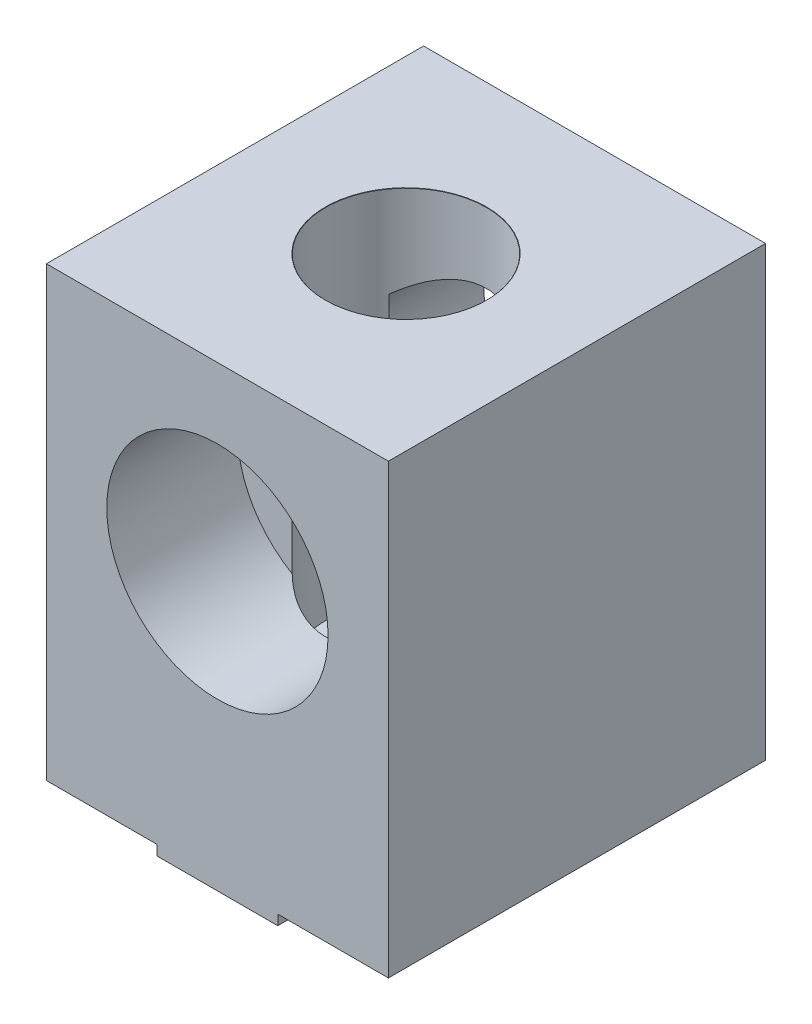
ISO-10303-21;
HEADER;
FILE_DESCRIPTION(('STEP AP214'),'2;1');
FILE_NAME('part.step','',(''),(''),'','','');
FILE_SCHEMA(('AUTOMOTIVE_DESIGN { 1 0 10303 214 1 1 1 1 }'));
ENDSEC;
DATA;
#1=APPLICATION_CONTEXT('core data for automotive mechanical design processes');
#2=APPLICATION_PROTOCOL_DEFINITION('international standard','automotive_design',2000,#1);
#3=PRODUCT_CONTEXT('',#1,'mechanical');
#4=PRODUCT('Part','Part','',(#3));
#5=PRODUCT_RELATED_PRODUCT_CATEGORY('part','',(#4));
#6=PRODUCT_DEFINITION_FORMATION('','',#4);
#7=PRODUCT_DEFINITION_CONTEXT('part definition',#1,'design');
#8=PRODUCT_DEFINITION('design','',#6,#7);
#9=PRODUCT_DEFINITION_SHAPE('','',#8);
#10=(LENGTH_UNIT() NAMED_UNIT(*) SI_UNIT(.MILLI.,.METRE.));
#11=(NAMED_UNIT(*) PLANE_ANGLE_UNIT() SI_UNIT($,.RADIAN.));
#12=(NAMED_UNIT(*) SI_UNIT($,.STERADIAN.) SOLID_ANGLE_UNIT());
#13=UNCERTAINTY_MEASURE_WITH_UNIT(LENGTH_MEASURE(1.E-05),#10,'distance_accuracy_value','');
#14=(GEOMETRIC_REPRESENTATION_CONTEXT(3) GLOBAL_UNCERTAINTY_ASSIGNED_CONTEXT((#13)) GLOBAL_UNIT_ASSIGNED_CONTEXT((#10,
#11,#12)) REPRESENTATION_CONTEXT('',''));
#15=CARTESIAN_POINT('',(0.,0.,0.));
#16=DIRECTION('',(0.,0.,1.));
#17=DIRECTION('',(1.,0.,0.));
#18=AXIS2_PLACEMENT_3D('',#15,#16,#17);
#19=CARTESIAN_POINT('',(0.,26.5,5.75));
#20=DIRECTION('',(0.,0.,1.));
#21=DIRECTION('',(1.,0.,0.));
#22=AXIS2_PLACEMENT_3D('',#19,#20,#21);
#23=PLANE('',#22);
#24=DIRECTION('',(0.,1.,0.));
#25=VECTOR('',#24,1.);
#26=CARTESIAN_POINT('',(5.56214886532174,44.5,5.75));
#27=LINE('',#26,#25);
#28=CARTESIAN_POINT('',(5.56214886532174,17.0098735519488,5.75));
#29=VERTEX_POINT('',#28);
#30=CARTESIAN_POINT('',(5.56214886532174,23.1365939882316,5.75000000000001));
#31=VERTEX_POINT('',#30);
#32=EDGE_CURVE('E277',#29,#31,#27,.T.);
#33=ORIENTED_EDGE('',*,*,#32,.F.);
#34=CARTESIAN_POINT('',(0.,26.5,5.75));
#35=DIRECTION('',(0.,0.,1.));
#36=DIRECTION('',(1.,0.,0.));
#37=AXIS2_PLACEMENT_3D('',#34,#35,#36);
#38=CIRCLE('',#37,11.);
#39=CARTESIAN_POINT('',(5.56214886532174,35.9901264480512,5.75));
#40=VERTEX_POINT('',#39);
#41=EDGE_CURVE('E279',#29,#40,#38,.T.);
#42=ORIENTED_EDGE('',*,*,#41,.T.);
#43=CARTESIAN_POINT('',(5.56214886532174,29.8634060117684,5.75000000000001));
#44=VERTEX_POINT('',#43);
#45=EDGE_CURVE('E282',#44,#40,#27,.T.);
#46=ORIENTED_EDGE('',*,*,#45,.F.);
#47=CARTESIAN_POINT('',(0.,26.5,5.75000000000001));
#48=DIRECTION('',(0.,0.,1.));
#49=DIRECTION('',(1.,0.,0.));
#50=AXIS2_PLACEMENT_3D('',#47,#48,#49);
#51=CIRCLE('',#50,6.5);
#52=EDGE_CURVE('E171',#44,#31,#51,.F.);
#53=ORIENTED_EDGE('',*,*,#52,.T.);
#54=EDGE_LOOP('',(#33,#42,#46,#53));
#55=FACE_BOUND('',#54,.T.);
#56=ADVANCED_FACE('F34',(#55),#23,.T.);
#57=CARTESIAN_POINT('',(0.,26.5,-4.75));
#58=DIRECTION('',(0.,0.,-1.));
#59=DIRECTION('',(-1.,0.,0.));
#60=AXIS2_PLACEMENT_3D('',#57,#58,#59);
#61=PLANE('',#60);
#62=DIRECTION('',(0.,1.,0.));
#63=VECTOR('',#62,1.);
#64=CARTESIAN_POINT('',(-6.43719659479187,44.5,-4.75));
#65=LINE('',#64,#63);
#66=CARTESIAN_POINT('',(-6.43719659479187,17.5802186125444,-4.75));
#67=VERTEX_POINT('',#66);
#68=CARTESIAN_POINT('',(-6.43719659479187,25.598612181134,-4.75));
#69=VERTEX_POINT('',#68);
#70=EDGE_CURVE('E55',#67,#69,#65,.T.);
#71=ORIENTED_EDGE('',*,*,#70,.F.);
#72=CARTESIAN_POINT('',(0.,26.5,-4.75));
#73=DIRECTION('',(0.,0.,-1.));
#74=DIRECTION('',(-1.,0.,0.));
#75=AXIS2_PLACEMENT_3D('',#72,#73,#74);
#76=CIRCLE('',#75,11.);
#77=CARTESIAN_POINT('',(-6.43719659479187,35.4197813874556,-4.75));
#78=VERTEX_POINT('',#77);
#79=EDGE_CURVE('E404',#67,#78,#76,.T.);
#80=ORIENTED_EDGE('',*,*,#79,.T.);
#81=CARTESIAN_POINT('',(-6.43719659479187,27.401387818866,-4.75));
#82=VERTEX_POINT('',#81);
#83=EDGE_CURVE('E241',#82,#78,#65,.T.);
#84=ORIENTED_EDGE('',*,*,#83,.F.);
#85=CARTESIAN_POINT('',(0.,26.5,-4.75));
#86=DIRECTION('',(0.,0.,-1.));
#87=DIRECTION('',(-1.,0.,0.));
#88=AXIS2_PLACEMENT_3D('',#85,#86,#87);
#89=CIRCLE('',#88,6.5);
#90=EDGE_CURVE('E180',#82,#69,#89,.F.);
#91=ORIENTED_EDGE('',*,*,#90,.T.);
#92=EDGE_LOOP('',(#71,#80,#84,#91));
#93=FACE_BOUND('',#92,.T.);
#94=ADVANCED_FACE('F265',(#93),#61,.T.);
#95=CARTESIAN_POINT('',(0.,26.5,-18.75));
#96=DIRECTION('',(0.,0.,1.));
#97=DIRECTION('',(1.,0.,0.));
#98=AXIS2_PLACEMENT_3D('',#95,#96,#97);
#99=CYLINDRICAL_SURFACE('',#98,6.5);
#100=CARTESIAN_POINT('',(6.43719659479187,25.598612181134,-4.75));
#101=VERTEX_POINT('',#100);
#102=CARTESIAN_POINT('',(6.43719659479187,27.401387818866,-4.75));
#103=VERTEX_POINT('',#102);
#104=EDGE_CURVE('E182',#101,#103,#89,.F.);
#105=ORIENTED_EDGE('',*,*,#104,.F.);
#106=CARTESIAN_POINT('',(6.43719659479187,25.598612181134,-4.75));
#107=CARTESIAN_POINT('',(6.4524030612427,25.7070631300714,-4.72936675707494));
#108=CARTESIAN_POINT('',(6.46492590004099,25.8165914736948,-4.71221198695385));
#109=CARTESIAN_POINT('',(6.4844364508842,26.0371037550259,-4.6853416724406));
#110=CARTESIAN_POINT('',(6.49142098285196,26.1480884918672,-4.67563040218764));
#111=CARTESIAN_POINT('',(6.49958855802063,26.3685118769073,-4.66426637227812));
#112=CARTESIAN_POINT('',(6.50088236925716,26.4779383231784,-4.66245975480426));
#113=CARTESIAN_POINT('',(6.49794715005671,26.6965069106706,-4.66655043508172));
#114=CARTESIAN_POINT('',(6.49372162472009,26.8056491882653,-4.67244284350368));
#115=CARTESIAN_POINT('',(6.48157064177737,26.9959233348769,-4.68927710251009));
#116=CARTESIAN_POINT('',(6.47482435377528,27.077281429588,-4.6986019468296));
#117=CARTESIAN_POINT('',(6.45828928707174,27.2397501289377,-4.72130098999083));
#118=CARTESIAN_POINT('',(6.44847804748751,27.3208542901834,-4.73470506328699));
#119=CARTESIAN_POINT('',(6.43719659479187,27.401387818866,-4.75));
#120=B_SPLINE_CURVE_WITH_KNOTS('',3,(#106,#107,#108,#109,#110,#111,#112,#113,#114,#115,#116,
#117,#118,#119),.UNSPECIFIED.,.F.,.F.,(4,2,2,2,2,2,4),(0.,0.334284375809515,0.668760557868532,
0.996696615168471,1.3244245151807,1.57077980610356,1.81898457770255),.UNSPECIFIED.);
#121=EDGE_CURVE('E11',#101,#103,#120,.T.);
#122=ORIENTED_EDGE('',*,*,#121,.T.);
#123=EDGE_LOOP('',(#105,#122));
#124=FACE_BOUND('',#123,.T.);
#125=ADVANCED_FACE('F273',(#124),#99,.F.);
#126=ORIENTED_EDGE('',*,*,#90,.F.);
#127=CARTESIAN_POINT('',(-6.43719659479187,27.401387818866,-4.75));
#128=CARTESIAN_POINT('',(-6.4524030612427,27.2929368699286,-4.72936675707494));
#129=CARTESIAN_POINT('',(-6.46492590004099,27.1834085263052,-4.71221198695385));
#130=CARTESIAN_POINT('',(-6.4844364508842,26.9628962449741,-4.6853416724406));
#131=CARTESIAN_POINT('',(-6.49142098285196,26.8519115081328,-4.67563040218764));
#132=CARTESIAN_POINT('',(-6.49958855802063,26.6314881230927,-4.66426637227812));
#133=CARTESIAN_POINT('',(-6.50088236925716,26.5220616768216,-4.66245975480426));
#134=CARTESIAN_POINT('',(-6.49794715005671,26.3034930893294,-4.66655043508172));
#135=CARTESIAN_POINT('',(-6.49372162472009,26.1943508117346,-4.67244284350368));
#136=CARTESIAN_POINT('',(-6.48157064177737,26.0040766651231,-4.68927710251009));
#137=CARTESIAN_POINT('',(-6.47482435377528,25.922718570412,-4.6986019468296));
#138=CARTESIAN_POINT('',(-6.45828928707174,25.7602498710623,-4.72130098999083));
#139=CARTESIAN_POINT('',(-6.44847804748751,25.6791457098166,-4.73470506328699));
#140=CARTESIAN_POINT('',(-6.43719659479187,25.598612181134,-4.75));
#141=B_SPLINE_CURVE_WITH_KNOTS('',3,(#127,#128,#129,#130,#131,#132,#133,#134,#135,#136,#137,
#138,#139,#140),.UNSPECIFIED.,.F.,.F.,(4,2,2,2,2,2,4),(0.,0.334284375809511,0.668760557868532,
0.996696615168478,1.3244245151807,1.57077980610356,1.81898457770255),.UNSPECIFIED.);
#142=EDGE_CURVE('E48',#82,#69,#141,.T.);
#143=ORIENTED_EDGE('',*,*,#142,.T.);
#144=EDGE_LOOP('',(#126,#143));
#145=FACE_BOUND('',#144,.T.);
#146=ADVANCED_FACE('F418',(#145),#99,.F.);
#147=ORIENTED_EDGE('',*,*,#52,.F.);
#148=CARTESIAN_POINT('',(5.56214886532174,29.8634060117684,5.75000000000001));
#149=CARTESIAN_POINT('',(5.63340506083755,29.7455268462414,5.68109518629558));
#150=CARTESIAN_POINT('',(5.70116934956883,29.6250395105297,5.61295776306665));
#151=CARTESIAN_POINT('',(5.82954700440894,29.3785078306234,5.47949823924309));
#152=CARTESIAN_POINT('',(5.89014837161641,29.2524546346246,5.41418097577999));
#153=CARTESIAN_POINT('',(6.00470874717272,28.9927696835234,5.28686460023617));
#154=CARTESIAN_POINT('',(6.05854539530324,28.8590487069112,5.22493565821318));
#155=CARTESIAN_POINT('',(6.1579080194862,28.5859783944607,5.10745351473488));
#156=CARTESIAN_POINT('',(6.20343913729291,28.4466326065184,5.05189637661327));
#157=CARTESIAN_POINT('',(6.3081679271547,28.0841125506181,4.92111709430223));
#158=CARTESIAN_POINT('',(6.3611963295704,27.8568185554411,4.85178590729966));
#159=CARTESIAN_POINT('',(6.42240076560405,27.5082773047338,4.77010673861153));
#160=CARTESIAN_POINT('',(6.4397240932633,27.3911494719361,4.74663278546957));
#161=CARTESIAN_POINT('',(6.46802749427909,27.1547965104282,4.70799301218242));
#162=CARTESIAN_POINT('',(6.47901092383491,27.0355725258841,4.69282279644606));
#163=CARTESIAN_POINT('',(6.49445059773882,26.7946669932029,4.6714335138389));
#164=CARTESIAN_POINT('',(6.49883929632058,26.6729727827151,4.66530708799413));
#165=CARTESIAN_POINT('',(6.50075741793979,26.4294248083981,4.66263401935487));
#166=CARTESIAN_POINT('',(6.49828697429873,26.307571047716,4.66608719036127));
#167=CARTESIAN_POINT('',(6.48654396772349,26.0646029660238,4.6823974674903));
#168=CARTESIAN_POINT('',(6.47725854370861,25.9434904802847,4.69527235393155));
#169=CARTESIAN_POINT('',(6.452105874424,25.7031670807374,4.72977596262445));
#170=CARTESIAN_POINT('',(6.43623487339671,25.5839572923898,4.75140967987007));
#171=CARTESIAN_POINT('',(6.39470322462161,25.3261800525549,4.80720225918797));
#172=CARTESIAN_POINT('',(6.36776663476478,25.1881631415222,4.84294712590794));
#173=CARTESIAN_POINT('',(6.30573310638989,24.9165986386811,4.92344444459291));
#174=CARTESIAN_POINT('',(6.27062951173623,24.7830547945445,4.96820423973598));
#175=CARTESIAN_POINT('',(6.19278545683016,24.5205567744258,5.0649053143254));
#176=CARTESIAN_POINT('',(6.15002809671956,24.3916135281584,5.11686242716368));
#177=CARTESIAN_POINT('',(6.05743514890498,24.1387286424674,5.22614685999435));
#178=CARTESIAN_POINT('',(6.00760197976597,24.0147853125464,5.28347234276723));
#179=CARTESIAN_POINT('',(5.89652963913865,23.7610601539339,5.40725712250928));
#180=CARTESIAN_POINT('',(5.83467232312612,23.631726327363,5.47407614783545));
#181=CARTESIAN_POINT('',(5.70376489565549,23.3795786082821,5.61034832506173));
#182=CARTESIAN_POINT('',(5.63476770200728,23.256725684561,5.67977996879303));
#183=CARTESIAN_POINT('',(5.56214886532174,23.1365939882316,5.75000000000001));
#184=B_SPLINE_CURVE_WITH_KNOTS('',3,(#148,#149,#150,#151,#152,#153,#154,#155,#156,#157,#158,
#159,#160,#161,#162,#163,#164,#165,#166,#167,#168,#169,#170,#171,#172,#173,#174,#175,#176,#177,
#178,#179,#180,#181,#182,#183),.UNSPECIFIED.,.F.,.F.,(4,2,2,2,2,2,2,2,2,2,2,2,2,2,2,2,2,4),(0.,
0.462036206882349,0.924835737761916,1.39507070702572,1.86501356976118,2.59229521628291,
2.95403017128207,3.31557345590549,3.68079515079085,4.04600974689322,4.41191534591238,
4.77802990849273,5.21263366606529,5.64759287565925,6.08352461531788,6.51930770731369,
6.99349347609538,7.46438718605061),.UNSPECIFIED.);
#185=EDGE_CURVE('E158',#44,#31,#184,.T.);
#186=ORIENTED_EDGE('',*,*,#185,.T.);
#187=EDGE_LOOP('',(#147,#186));
#188=FACE_BOUND('',#187,.T.);
#189=ADVANCED_FACE('F422',(#188),#99,.F.);
#190=CARTESIAN_POINT('',(-5.56214886532174,23.1365939882316,5.75000000000001));
#191=VERTEX_POINT('',#190);
#192=CARTESIAN_POINT('',(-5.56214886532174,29.8634060117684,5.75000000000001));
#193=VERTEX_POINT('',#192);
#194=EDGE_CURVE('E164',#191,#193,#51,.F.);
#195=ORIENTED_EDGE('',*,*,#194,.F.);
#196=CARTESIAN_POINT('',(-5.56214886532174,23.1365939882316,5.75000000000001));
#197=CARTESIAN_POINT('',(-5.63340506083755,23.2544731537586,5.68109518629558));
#198=CARTESIAN_POINT('',(-5.70116934956883,23.3749604894703,5.61295776306665));
#199=CARTESIAN_POINT('',(-5.82954700440894,23.6214921693766,5.47949823924309));
#200=CARTESIAN_POINT('',(-5.89014837161641,23.7475453653754,5.41418097577999));
#201=CARTESIAN_POINT('',(-6.00470874717272,24.0072303164766,5.28686460023617));
#202=CARTESIAN_POINT('',(-6.05854539530324,24.1409512930888,5.22493565821318));
#203=CARTESIAN_POINT('',(-6.1579080194862,24.4140216055393,5.10745351473488));
#204=CARTESIAN_POINT('',(-6.20343913729291,24.5533673934816,5.05189637661327));
#205=CARTESIAN_POINT('',(-6.3081679271547,24.9158874493819,4.92111709430223));
#206=CARTESIAN_POINT('',(-6.3611963295704,25.1431814445589,4.85178590729966));
#207=CARTESIAN_POINT('',(-6.42240076560405,25.4917226952662,4.77010673861153));
#208=CARTESIAN_POINT('',(-6.4397240932633,25.6088505280639,4.74663278546957));
#209=CARTESIAN_POINT('',(-6.46802749427909,25.8452034895718,4.70799301218242));
#210=CARTESIAN_POINT('',(-6.47901092383491,25.9644274741159,4.69282279644606));
#211=CARTESIAN_POINT('',(-6.49445059773882,26.2053330067971,4.6714335138389));
#212=CARTESIAN_POINT('',(-6.49883929632058,26.3270272172849,4.66530708799413));
#213=CARTESIAN_POINT('',(-6.50075741793979,26.5705751916019,4.66263401935487));
#214=CARTESIAN_POINT('',(-6.49828697429873,26.692428952284,4.66608719036127));
#215=CARTESIAN_POINT('',(-6.48654396772349,26.9353970339762,4.6823974674903));
#216=CARTESIAN_POINT('',(-6.47725854370861,27.0565095197153,4.69527235393155));
#217=CARTESIAN_POINT('',(-6.452105874424,27.2968329192626,4.72977596262445));
#218=CARTESIAN_POINT('',(-6.43623487339671,27.4160427076102,4.75140967987007));
#219=CARTESIAN_POINT('',(-6.39470322462161,27.673819947445,4.80720225918797));
#220=CARTESIAN_POINT('',(-6.36776663476478,27.8118368584778,4.84294712590794));
#221=CARTESIAN_POINT('',(-6.30573310638989,28.0834013613189,4.9234444445929));
#222=CARTESIAN_POINT('',(-6.27062951173623,28.2169452054555,4.96820423973598));
#223=CARTESIAN_POINT('',(-6.19278545683016,28.4794432255742,5.0649053143254));
#224=CARTESIAN_POINT('',(-6.15002809671956,28.6083864718416,5.11686242716367));
#225=CARTESIAN_POINT('',(-6.05743514890498,28.8612713575326,5.22614685999435));
#226=CARTESIAN_POINT('',(-6.00760197976597,28.9852146874536,5.28347234276723));
#227=CARTESIAN_POINT('',(-5.89652963913865,29.2389398460661,5.40725712250928));
#228=CARTESIAN_POINT('',(-5.83467232312612,29.368273672637,5.47407614783545));
#229=CARTESIAN_POINT('',(-5.70376489565549,29.6204213917179,5.61034832506173));
#230=CARTESIAN_POINT('',(-5.63476770200728,29.743274315439,5.67977996879303));
#231=CARTESIAN_POINT('',(-5.56214886532174,29.8634060117684,5.75000000000001));
#232=B_SPLINE_CURVE_WITH_KNOTS('',3,(#196,#197,#198,#199,#200,#201,#202,#203,#204,#205,#206,
#207,#208,#209,#210,#211,#212,#213,#214,#215,#216,#217,#218,#219,#220,#221,#222,#223,#224,#225,
#226,#227,#228,#229,#230,#231),.UNSPECIFIED.,.F.,.F.,(4,2,2,2,2,2,2,2,2,2,2,2,2,2,2,2,2,4),(0.,
0.462036206882349,0.924835737761916,1.39507070702572,1.86501356976118,2.5922952162829,
2.95403017128207,3.31557345590549,3.68079515079085,4.04600974689322,4.41191534591238,
4.77802990849273,5.21263366606528,5.64759287565924,6.08352461531787,6.51930770731369,
6.99349347609538,7.46438718605061),.UNSPECIFIED.);
#233=EDGE_CURVE('E150',#191,#193,#232,.T.);
#234=ORIENTED_EDGE('',*,*,#233,.T.);
#235=EDGE_LOOP('',(#195,#234));
#236=FACE_BOUND('',#235,.T.);
#237=ADVANCED_FACE('F169',(#236),#99,.F.);
#238=CARTESIAN_POINT('',(0.,0.,0.));
#239=DIRECTION('',(0.,1.,0.));
#240=DIRECTION('',(0.,0.,1.));
#241=AXIS2_PLACEMENT_3D('',#238,#239,#240);
#242=PLANE('',#241);
#243=DIRECTION('',(0.,0.,1.));
#244=VECTOR('',#243,1.);
#245=CARTESIAN_POINT('',(6.,0.,-18.75));
#246=LINE('',#245,#244);
#247=CARTESIAN_POINT('',(6.,0.,-18.75));
#248=VERTEX_POINT('',#247);
#249=CARTESIAN_POINT('',(6.,0.,18.75));
#250=VERTEX_POINT('',#249);
#251=EDGE_CURVE('E170',#248,#250,#246,.T.);
#252=ORIENTED_EDGE('',*,*,#251,.F.);
#253=DIRECTION('',(-1.,0.,0.));
#254=VECTOR('',#253,1.);
#255=CARTESIAN_POINT('',(-17.,0.,-18.75));
#256=LINE('',#255,#254);
#257=CARTESIAN_POINT('',(17.,0.,-18.75));
#258=VERTEX_POINT('',#257);
#259=EDGE_CURVE('E330',#258,#248,#256,.T.);
#260=ORIENTED_EDGE('',*,*,#259,.F.);
#261=DIRECTION('',(0.,0.,-1.));
#262=VECTOR('',#261,1.);
#263=CARTESIAN_POINT('',(17.,0.,-18.75));
#264=LINE('',#263,#262);
#265=CARTESIAN_POINT('',(17.,0.,18.75));
#266=VERTEX_POINT('',#265);
#267=EDGE_CURVE('E315',#266,#258,#264,.T.);
#268=ORIENTED_EDGE('',*,*,#267,.F.);
#269=DIRECTION('',(1.,0.,0.));
#270=VECTOR('',#269,1.);
#271=CARTESIAN_POINT('',(-17.,0.,18.75));
#272=LINE('',#271,#270);
#273=EDGE_CURVE('E335',#250,#266,#272,.T.);
#274=ORIENTED_EDGE('',*,*,#273,.F.);
#275=EDGE_LOOP('',(#252,#260,#268,#274));
#276=FACE_BOUND('',#275,.T.);
#277=ADVANCED_FACE('F358',(#276),#242,.F.);
#278=DIRECTION('',(0.,0.,-1.));
#279=VECTOR('',#278,1.);
#280=CARTESIAN_POINT('',(-6.,0.,-18.75));
#281=LINE('',#280,#279);
#282=CARTESIAN_POINT('',(-6.,0.,18.75));
#283=VERTEX_POINT('',#282);
#284=CARTESIAN_POINT('',(-6.,0.,-18.75));
#285=VERTEX_POINT('',#284);
#286=EDGE_CURVE('E174',#283,#285,#281,.T.);
#287=ORIENTED_EDGE('',*,*,#286,.F.);
#288=CARTESIAN_POINT('',(-17.,0.,18.75));
#289=VERTEX_POINT('',#288);
#290=EDGE_CURVE('E320',#289,#283,#272,.T.);
#291=ORIENTED_EDGE('',*,*,#290,.F.);
#292=DIRECTION('',(0.,0.,1.));
#293=VECTOR('',#292,1.);
#294=CARTESIAN_POINT('',(-17.,0.,-18.75));
#295=LINE('',#294,#293);
#296=CARTESIAN_POINT('',(-17.,0.,-18.75));
#297=VERTEX_POINT('',#296);
#298=EDGE_CURVE('E333',#297,#289,#295,.T.);
#299=ORIENTED_EDGE('',*,*,#298,.F.);
#300=EDGE_CURVE('E329',#285,#297,#256,.T.);
#301=ORIENTED_EDGE('',*,*,#300,.F.);
#302=EDGE_LOOP('',(#287,#291,#299,#301));
#303=FACE_BOUND('',#302,.T.);
#304=ADVANCED_FACE('F372',(#303),#242,.F.);
#305=CARTESIAN_POINT('',(17.,44.5,-18.75));
#306=DIRECTION('',(-1.,0.,0.));
#307=DIRECTION('',(0.,0.,1.));
#308=AXIS2_PLACEMENT_3D('',#305,#306,#307);
#309=PLANE('',#308);
#310=ORIENTED_EDGE('',*,*,#267,.T.);
#311=DIRECTION('',(0.,-1.,0.));
#312=VECTOR('',#311,1.);
#313=CARTESIAN_POINT('',(17.,44.5,-18.75));
#314=LINE('',#313,#312);
#315=CARTESIAN_POINT('',(17.,44.5,-18.75));
#316=VERTEX_POINT('',#315);
#317=EDGE_CURVE('E159',#316,#258,#314,.T.);
#318=ORIENTED_EDGE('',*,*,#317,.F.);
#319=DIRECTION('',(0.,0.,-1.));
#320=VECTOR('',#319,1.);
#321=CARTESIAN_POINT('',(17.,44.5,-18.75));
#322=LINE('',#321,#320);
#323=CARTESIAN_POINT('',(17.,44.5,18.75));
#324=VERTEX_POINT('',#323);
#325=EDGE_CURVE('E316',#324,#316,#322,.T.);
#326=ORIENTED_EDGE('',*,*,#325,.F.);
#327=DIRECTION('',(0.,-1.,0.));
#328=VECTOR('',#327,1.);
#329=CARTESIAN_POINT('',(17.,44.5,18.75));
#330=LINE('',#329,#328);
#331=EDGE_CURVE('E326',#324,#266,#330,.T.);
#332=ORIENTED_EDGE('',*,*,#331,.T.);
#333=EDGE_LOOP('',(#310,#318,#326,#332));
#334=FACE_BOUND('',#333,.T.);
#335=ADVANCED_FACE('F36',(#334),#309,.F.);
#336=CARTESIAN_POINT('',(-17.,44.5,-18.75));
#337=DIRECTION('',(0.,0.,1.));
#338=DIRECTION('',(1.,0.,0.));
#339=AXIS2_PLACEMENT_3D('',#336,#337,#338);
#340=PLANE('',#339);
#341=CARTESIAN_POINT('',(0.,26.5,-18.75));
#342=DIRECTION('',(0.,0.,-1.));
#343=DIRECTION('',(-1.,0.,0.));
#344=AXIS2_PLACEMENT_3D('',#341,#342,#343);
#345=CIRCLE('',#344,11.);
#346=CARTESIAN_POINT('',(-11.,26.5,-18.75));
#347=VERTEX_POINT('',#346);
#348=EDGE_CURVE('E289',#347,#347,#345,.T.);
#349=ORIENTED_EDGE('',*,*,#348,.F.);
#350=EDGE_LOOP('',(#349));
#351=FACE_BOUND('',#350,.T.);
#352=ORIENTED_EDGE('',*,*,#259,.T.);
#353=DIRECTION('',(0.,1.,0.));
#354=VECTOR('',#353,1.);
#355=CARTESIAN_POINT('',(6.,-1.,-18.75));
#356=LINE('',#355,#354);
#357=CARTESIAN_POINT('',(6.,-1.,-18.75));
#358=VERTEX_POINT('',#357);
#359=EDGE_CURVE('E300',#358,#248,#356,.T.);
#360=ORIENTED_EDGE('',*,*,#359,.F.);
#361=DIRECTION('',(1.,0.,0.));
#362=VECTOR('',#361,1.);
#363=CARTESIAN_POINT('',(-6.,-1.,-18.75));
#364=LINE('',#363,#362);
#365=CARTESIAN_POINT('',(-6.,-1.,-18.75));
#366=VERTEX_POINT('',#365);
#367=EDGE_CURVE('E299',#366,#358,#364,.T.);
#368=ORIENTED_EDGE('',*,*,#367,.F.);
#369=DIRECTION('',(0.,1.,0.));
#370=VECTOR('',#369,1.);
#371=CARTESIAN_POINT('',(-6.,-1.,-18.75));
#372=LINE('',#371,#370);
#373=EDGE_CURVE('E306',#366,#285,#372,.T.);
#374=ORIENTED_EDGE('',*,*,#373,.T.);
#375=ORIENTED_EDGE('',*,*,#300,.T.);
#376=DIRECTION('',(0.,-1.,0.));
#377=VECTOR('',#376,1.);
#378=CARTESIAN_POINT('',(-17.,44.5,-18.75));
#379=LINE('',#378,#377);
#380=CARTESIAN_POINT('',(-17.,44.5,-18.75));
#381=VERTEX_POINT('',#380);
#382=EDGE_CURVE('E342',#381,#297,#379,.T.);
#383=ORIENTED_EDGE('',*,*,#382,.F.);
#384=DIRECTION('',(-1.,0.,0.));
#385=VECTOR('',#384,1.);
#386=CARTESIAN_POINT('',(-17.,44.5,-18.75));
#387=LINE('',#386,#385);
#388=EDGE_CURVE('E319',#316,#381,#387,.T.);
#389=ORIENTED_EDGE('',*,*,#388,.F.);
#390=ORIENTED_EDGE('',*,*,#317,.T.);
#391=EDGE_LOOP('',(#352,#360,#368,#374,#375,#383,#389,#390));
#392=FACE_BOUND('',#391,.T.);
#393=ADVANCED_FACE('F351',(#351,#392),#340,.F.);
#394=CARTESIAN_POINT('',(-17.,44.5,-18.75));
#395=DIRECTION('',(1.,0.,0.));
#396=DIRECTION('',(0.,0.,-1.));
#397=AXIS2_PLACEMENT_3D('',#394,#395,#396);
#398=PLANE('',#397);
#399=ORIENTED_EDGE('',*,*,#298,.T.);
#400=DIRECTION('',(0.,-1.,0.));
#401=VECTOR('',#400,1.);
#402=CARTESIAN_POINT('',(-17.,44.5,18.75));
#403=LINE('',#402,#401);
#404=CARTESIAN_POINT('',(-17.,44.5,18.75));
#405=VERTEX_POINT('',#404);
#406=EDGE_CURVE('E340',#405,#289,#403,.T.);
#407=ORIENTED_EDGE('',*,*,#406,.F.);
#408=DIRECTION('',(0.,0.,1.));
#409=VECTOR('',#408,1.);
#410=CARTESIAN_POINT('',(-17.,44.5,-18.75));
#411=LINE('',#410,#409);
#412=EDGE_CURVE('E322',#381,#405,#411,.T.);
#413=ORIENTED_EDGE('',*,*,#412,.F.);
#414=ORIENTED_EDGE('',*,*,#382,.T.);
#415=EDGE_LOOP('',(#399,#407,#413,#414));
#416=FACE_BOUND('',#415,.T.);
#417=ADVANCED_FACE('F377',(#416),#398,.F.);
#418=CARTESIAN_POINT('',(-17.,44.5,18.75));
#419=DIRECTION('',(0.,0.,-1.));
#420=DIRECTION('',(-1.,0.,0.));
#421=AXIS2_PLACEMENT_3D('',#418,#419,#420);
#422=PLANE('',#421);
#423=CARTESIAN_POINT('',(0.,26.5,18.75));
#424=DIRECTION('',(0.,0.,1.));
#425=DIRECTION('',(1.,0.,0.));
#426=AXIS2_PLACEMENT_3D('',#423,#424,#425);
#427=CIRCLE('',#426,11.);
#428=CARTESIAN_POINT('',(11.,26.5,18.75));
#429=VERTEX_POINT('',#428);
#430=EDGE_CURVE('E284',#429,#429,#427,.T.);
#431=ORIENTED_EDGE('',*,*,#430,.F.);
#432=EDGE_LOOP('',(#431));
#433=FACE_BOUND('',#432,.T.);
#434=ORIENTED_EDGE('',*,*,#290,.T.);
#435=DIRECTION('',(0.,1.,0.));
#436=VECTOR('',#435,1.);
#437=CARTESIAN_POINT('',(-6.,-1.,18.75));
#438=LINE('',#437,#436);
#439=CARTESIAN_POINT('',(-6.,-1.,18.75));
#440=VERTEX_POINT('',#439);
#441=EDGE_CURVE('E309',#440,#283,#438,.T.);
#442=ORIENTED_EDGE('',*,*,#441,.F.);
#443=DIRECTION('',(-1.,0.,0.));
#444=VECTOR('',#443,1.);
#445=CARTESIAN_POINT('',(-6.,-1.,18.75));
#446=LINE('',#445,#444);
#447=CARTESIAN_POINT('',(6.,-1.,18.75));
#448=VERTEX_POINT('',#447);
#449=EDGE_CURVE('E295',#448,#440,#446,.T.);
#450=ORIENTED_EDGE('',*,*,#449,.F.);
#451=DIRECTION('',(0.,1.,0.));
#452=VECTOR('',#451,1.);
#453=CARTESIAN_POINT('',(6.,-1.,18.75));
#454=LINE('',#453,#452);
#455=EDGE_CURVE('E312',#448,#250,#454,.T.);
#456=ORIENTED_EDGE('',*,*,#455,.T.);
#457=ORIENTED_EDGE('',*,*,#273,.T.);
#458=ORIENTED_EDGE('',*,*,#331,.F.);
#459=DIRECTION('',(1.,0.,0.));
#460=VECTOR('',#459,1.);
#461=CARTESIAN_POINT('',(-17.,44.5,18.75));
#462=LINE('',#461,#460);
#463=EDGE_CURVE('E324',#405,#324,#462,.T.);
#464=ORIENTED_EDGE('',*,*,#463,.F.);
#465=ORIENTED_EDGE('',*,*,#406,.T.);
#466=EDGE_LOOP('',(#434,#442,#450,#456,#457,#458,#464,#465));
#467=FACE_BOUND('',#466,.T.);
#468=ADVANCED_FACE('F374',(#433,#467),#422,.F.);
#469=CARTESIAN_POINT('',(0.,44.5,0.));
#470=DIRECTION('',(0.,1.,0.));
#471=DIRECTION('',(0.,0.,1.));
#472=AXIS2_PLACEMENT_3D('',#469,#470,#471);
#473=PLANE('',#472);
#474=CARTESIAN_POINT('',(0.,44.5,0.));
#475=DIRECTION('',(0.,1.,0.));
#476=DIRECTION('',(0.,0.,1.));
#477=AXIS2_PLACEMENT_3D('',#474,#475,#476);
#478=CIRCLE('',#477,8.025);
#479=CARTESIAN_POINT('',(0.,44.5,8.025));
#480=VERTEX_POINT('',#479);
#481=EDGE_CURVE('E445',#480,#480,#478,.T.);
#482=ORIENTED_EDGE('',*,*,#481,.F.);
#483=EDGE_LOOP('',(#482));
#484=FACE_BOUND('',#483,.T.);
#485=ORIENTED_EDGE('',*,*,#325,.T.);
#486=ORIENTED_EDGE('',*,*,#388,.T.);
#487=ORIENTED_EDGE('',*,*,#412,.T.);
#488=ORIENTED_EDGE('',*,*,#463,.T.);
#489=EDGE_LOOP('',(#485,#486,#487,#488));
#490=FACE_BOUND('',#489,.T.);
#491=ADVANCED_FACE('F379',(#484,#490),#473,.T.);
#492=CARTESIAN_POINT('',(6.,-1.,-18.75));
#493=DIRECTION('',(-1.,0.,0.));
#494=DIRECTION('',(0.,0.,1.));
#495=AXIS2_PLACEMENT_3D('',#492,#493,#494);
#496=PLANE('',#495);
#497=ORIENTED_EDGE('',*,*,#251,.T.);
#498=ORIENTED_EDGE('',*,*,#455,.F.);
#499=DIRECTION('',(0.,0.,1.));
#500=VECTOR('',#499,1.);
#501=CARTESIAN_POINT('',(6.,-1.,-18.75));
#502=LINE('',#501,#500);
#503=EDGE_CURVE('E292',#358,#448,#502,.T.);
#504=ORIENTED_EDGE('',*,*,#503,.F.);
#505=ORIENTED_EDGE('',*,*,#359,.T.);
#506=EDGE_LOOP('',(#497,#498,#504,#505));
#507=FACE_BOUND('',#506,.T.);
#508=ADVANCED_FACE('F361',(#507),#496,.F.);
#509=CARTESIAN_POINT('',(-6.,-1.,-18.75));
#510=DIRECTION('',(1.,0.,0.));
#511=DIRECTION('',(0.,0.,-1.));
#512=AXIS2_PLACEMENT_3D('',#509,#510,#511);
#513=PLANE('',#512);
#514=ORIENTED_EDGE('',*,*,#286,.T.);
#515=ORIENTED_EDGE('',*,*,#373,.F.);
#516=DIRECTION('',(0.,0.,-1.));
#517=VECTOR('',#516,1.);
#518=CARTESIAN_POINT('',(-6.,-1.,-18.75));
#519=LINE('',#518,#517);
#520=EDGE_CURVE('E297',#440,#366,#519,.T.);
#521=ORIENTED_EDGE('',*,*,#520,.F.);
#522=ORIENTED_EDGE('',*,*,#441,.T.);
#523=EDGE_LOOP('',(#514,#515,#521,#522));
#524=FACE_BOUND('',#523,.T.);
#525=ADVANCED_FACE('F369',(#524),#513,.F.);
#526=CARTESIAN_POINT('',(0.,-1.,0.));
#527=DIRECTION('',(0.,1.,0.));
#528=DIRECTION('',(0.,0.,1.));
#529=AXIS2_PLACEMENT_3D('',#526,#527,#528);
#530=PLANE('',#529);
#531=CARTESIAN_POINT('',(0.,-1.,0.));
#532=DIRECTION('',(0.,1.,0.));
#533=DIRECTION('',(0.,0.,1.));
#534=AXIS2_PLACEMENT_3D('',#531,#532,#533);
#535=CIRCLE('',#534,3.29999999999999);
#536=CARTESIAN_POINT('',(0.,-1.,3.29999999999999));
#537=VERTEX_POINT('',#536);
#538=EDGE_CURVE('E167',#537,#537,#535,.T.);
#539=ORIENTED_EDGE('',*,*,#538,.T.);
#540=EDGE_LOOP('',(#539));
#541=FACE_BOUND('',#540,.T.);
#542=ORIENTED_EDGE('',*,*,#503,.T.);
#543=ORIENTED_EDGE('',*,*,#449,.T.);
#544=ORIENTED_EDGE('',*,*,#520,.T.);
#545=ORIENTED_EDGE('',*,*,#367,.T.);
#546=EDGE_LOOP('',(#542,#543,#544,#545));
#547=FACE_BOUND('',#546,.T.);
#548=ADVANCED_FACE('F256',(#541,#547),#530,.F.);
#549=DIRECTION('',(0.,1.,0.));
#550=VECTOR('',#549,1.);
#551=CARTESIAN_POINT('',(-5.56214886532174,44.5,5.75));
#552=LINE('',#551,#550);
#553=CARTESIAN_POINT('',(-5.56214886532174,35.9901264480512,5.75));
#554=VERTEX_POINT('',#553);
#555=EDGE_CURVE('E63',#554,#193,#552,.F.);
#556=ORIENTED_EDGE('',*,*,#555,.F.);
#557=CARTESIAN_POINT('',(-5.56214886532174,17.0098735519488,5.75));
#558=VERTEX_POINT('',#557);
#559=EDGE_CURVE('E166',#554,#558,#38,.T.);
#560=ORIENTED_EDGE('',*,*,#559,.T.);
#561=EDGE_CURVE('E153',#191,#558,#552,.F.);
#562=ORIENTED_EDGE('',*,*,#561,.F.);
#563=ORIENTED_EDGE('',*,*,#194,.T.);
#564=EDGE_LOOP('',(#556,#560,#562,#563));
#565=FACE_BOUND('',#564,.T.);
#566=ADVANCED_FACE('F163',(#565),#23,.T.);
#567=CARTESIAN_POINT('',(0.,26.5,5.75));
#568=DIRECTION('',(0.,0.,1.));
#569=DIRECTION('',(1.,0.,0.));
#570=AXIS2_PLACEMENT_3D('',#567,#568,#569);
#571=CYLINDRICAL_SURFACE('',#570,11.);
#572=ORIENTED_EDGE('',*,*,#41,.F.);
#573=CARTESIAN_POINT('',(5.56214886532174,17.0098735519488,5.75));
#574=CARTESIAN_POINT('',(5.41225504034301,16.922004115632,5.89498090277355));
#575=CARTESIAN_POINT('',(5.2562873088983,16.8353799719849,6.03452250831815));
#576=CARTESIAN_POINT('',(4.93241991614292,16.6661522685572,6.30201854743918));
#577=CARTESIAN_POINT('',(4.76451007914317,16.5835522411222,6.42996288284294));
#578=CARTESIAN_POINT('',(4.41571727239547,16.4233632329751,6.67436574413036));
#579=CARTESIAN_POINT('',(4.2347337849493,16.3458243319052,6.79071416706526));
#580=CARTESIAN_POINT('',(3.86172455932784,16.1981896911828,7.0095525797668));
#581=CARTESIAN_POINT('',(3.66970145733135,16.1280921858666,7.11204585861001));
#582=CARTESIAN_POINT('',(3.27421656381525,15.9965155075488,7.30259961339069));
#583=CARTESIAN_POINT('',(3.07069344070156,15.9350901670251,7.39057046678264));
#584=CARTESIAN_POINT('',(2.65442097974261,15.8228980433329,7.5500809538013));
#585=CARTESIAN_POINT('',(2.4416709819413,15.7721320240987,7.62161940978215));
#586=CARTESIAN_POINT('',(2.0094085600388,15.6828478609529,7.74678622585488));
#587=CARTESIAN_POINT('',(1.78992684438666,15.6442811817242,7.80048560305122));
#588=CARTESIAN_POINT('',(1.34536957463877,15.5802758519816,7.88931733951144));
#589=CARTESIAN_POINT('',(1.12029514870117,15.5548345759939,7.92445341202591));
#590=CARTESIAN_POINT('',(0.6971220380069,15.5203414267857,7.97202150738611));
#591=CARTESIAN_POINT('',(0.499430660319876,15.5095557906534,7.98685720418454));
#592=CARTESIAN_POINT('',(0.103204853059826,15.4986996118665,8.00178971919154));
#593=CARTESIAN_POINT('',(-0.0953294960718205,15.4986280688112,8.00188791347602));
#594=CARTESIAN_POINT('',(-0.491664505588805,15.509204278538,7.98734090028622));
#595=CARTESIAN_POINT('',(-0.689464745956656,15.519857431653,7.9726882651526));
#596=CARTESIAN_POINT('',(-1.08259522019124,15.5516268074359,7.92887780478158));
#597=CARTESIAN_POINT('',(-1.27792549717868,15.5727428471831,7.89972023313134));
#598=CARTESIAN_POINT('',(-1.6495202335637,15.6228931336231,7.83019695068165));
#599=CARTESIAN_POINT('',(-1.82608417375903,15.6511820148463,7.79088185103373));
#600=CARTESIAN_POINT('',(-2.17484609553624,15.7156823597718,7.70081130968172));
#601=CARTESIAN_POINT('',(-2.34704259018834,15.7518964823285,7.65005202837387));
#602=CARTESIAN_POINT('',(-2.68611805587965,15.8315843347694,7.53768295456351));
#603=CARTESIAN_POINT('',(-2.85299724309061,15.8750577690813,7.47607360383001));
#604=CARTESIAN_POINT('',(-3.18075542136574,15.9685288104771,7.34262501676915));
#605=CARTESIAN_POINT('',(-3.34163222332897,16.0185287684821,7.27078209334826));
#606=CARTESIAN_POINT('',(-3.84346926399099,16.1869332129961,7.02667368810937));
#607=CARTESIAN_POINT('',(-4.17213824336376,16.3162399176614,6.83621575721749));
#608=CARTESIAN_POINT('',(-4.79352640793134,16.5935421356218,6.41583529080885));
#609=CARTESIAN_POINT('',(-5.08628146922748,16.7415186938969,6.18595269825446));
#610=CARTESIAN_POINT('',(-5.42869382269165,16.9325823984582,5.87688435891741));
#611=CARTESIAN_POINT('',(-5.49601909909229,16.9711113636651,5.81396574476233));
#612=CARTESIAN_POINT('',(-5.56214886532174,17.0098735519488,5.75000000000001));
#613=B_SPLINE_CURVE_WITH_KNOTS('',3,(#573,#574,#575,#576,#577,#578,#579,#580,#581,#582,#583,
#584,#585,#586,#587,#588,#589,#590,#591,#592,#593,#594,#595,#596,#597,#598,#599,#600,#601,#602,
#603,#604,#605,#606,#607,#608,#609,#610,#611,#612),.UNSPECIFIED.,.F.,.F.,(4,2,2,2,2,2,2,2,2,2,2,
2,2,2,2,2,2,2,2,4),(0.,0.678812830658176,1.35821116211609,2.04354464312142,2.72871514584115,
3.41796761532342,4.10726946544238,4.79379337872333,5.48017991337122,6.07499116498279,
6.66974687760794,7.26480222447455,7.8598471684625,8.4085170695976,8.95737132801842,
9.5062032445759,10.0552334044344,11.2542713706287,12.4521016356275,12.7516776329717),.UNSPECIFIED.);
#614=EDGE_CURVE('E225',#29,#558,#613,.T.);
#615=ORIENTED_EDGE('',*,*,#614,.T.);
#616=ORIENTED_EDGE('',*,*,#559,.F.);
#617=CARTESIAN_POINT('',(-5.56214886532174,35.9901264480512,5.75));
#618=CARTESIAN_POINT('',(-5.41225504034301,36.077995884368,5.89498090277355));
#619=CARTESIAN_POINT('',(-5.2562873088983,36.1646200280151,6.03452250831815));
#620=CARTESIAN_POINT('',(-4.93241991614292,36.3338477314428,6.30201854743918));
#621=CARTESIAN_POINT('',(-4.76451007914317,36.4164477588778,6.42996288284294));
#622=CARTESIAN_POINT('',(-4.41571727239547,36.5766367670249,6.67436574413037));
#623=CARTESIAN_POINT('',(-4.2347337849493,36.6541756680948,6.79071416706525));
#624=CARTESIAN_POINT('',(-3.86172455932784,36.8018103088172,7.0095525797668));
#625=CARTESIAN_POINT('',(-3.66970145733135,36.8719078141334,7.11204585861001));
#626=CARTESIAN_POINT('',(-3.27421656381525,37.0034844924512,7.30259961339069));
#627=CARTESIAN_POINT('',(-3.07069344070157,37.0649098329748,7.39057046678264));
#628=CARTESIAN_POINT('',(-2.65442097974261,37.1771019566671,7.5500809538013));
#629=CARTESIAN_POINT('',(-2.4416709819413,37.2278679759013,7.62161940978215));
#630=CARTESIAN_POINT('',(-2.0094085600388,37.3171521390471,7.74678622585488));
#631=CARTESIAN_POINT('',(-1.78992684438666,37.3557188182758,7.80048560305122));
#632=CARTESIAN_POINT('',(-1.34536957463877,37.4197241480184,7.88931733951144));
#633=CARTESIAN_POINT('',(-1.12029514870117,37.4451654240061,7.92445341202591));
#634=CARTESIAN_POINT('',(-0.697122038006901,37.4796585732143,7.97202150738611));
#635=CARTESIAN_POINT('',(-0.499430660319876,37.4904442093466,7.98685720418454));
#636=CARTESIAN_POINT('',(-0.103204853059826,37.5013003881335,8.00178971919154));
#637=CARTESIAN_POINT('',(0.0953294960718205,37.5013719311888,8.00188791347602));
#638=CARTESIAN_POINT('',(0.491664505588805,37.490795721462,7.98734090028622));
#639=CARTESIAN_POINT('',(0.689464745956656,37.480142568347,7.9726882651526));
#640=CARTESIAN_POINT('',(1.08259522019124,37.4483731925641,7.92887780478158));
#641=CARTESIAN_POINT('',(1.27792549717868,37.4272571528169,7.89972023313134));
#642=CARTESIAN_POINT('',(1.6495202335637,37.3771068663769,7.83019695068165));
#643=CARTESIAN_POINT('',(1.82608417375904,37.3488179851537,7.79088185103373));
#644=CARTESIAN_POINT('',(2.17484609553624,37.2843176402282,7.70081130968172));
#645=CARTESIAN_POINT('',(2.34704259018834,37.2481035176715,7.65005202837387));
#646=CARTESIAN_POINT('',(2.68611805587965,37.1684156652306,7.53768295456351));
#647=CARTESIAN_POINT('',(2.85299724309061,37.1249422309187,7.47607360383001));
#648=CARTESIAN_POINT('',(3.18075542136574,37.0314711895229,7.34262501676915));
#649=CARTESIAN_POINT('',(3.34163222332897,36.9814712315179,7.27078209334826));
#650=CARTESIAN_POINT('',(3.84346926399099,36.8130667870039,7.02667368810936));
#651=CARTESIAN_POINT('',(4.17213824336376,36.6837600823386,6.83621575721749));
#652=CARTESIAN_POINT('',(4.79352640793134,36.4064578643782,6.41583529080885));
#653=CARTESIAN_POINT('',(5.08628146922748,36.2584813061031,6.18595269825446));
#654=CARTESIAN_POINT('',(5.42869382269165,36.0674176015418,5.8768843589174));
#655=CARTESIAN_POINT('',(5.49601909909229,36.0288886363349,5.81396574476233));
#656=CARTESIAN_POINT('',(5.56214886532174,35.9901264480512,5.75));
#657=B_SPLINE_CURVE_WITH_KNOTS('',3,(#617,#618,#619,#620,#621,#622,#623,#624,#625,#626,#627,
#628,#629,#630,#631,#632,#633,#634,#635,#636,#637,#638,#639,#640,#641,#642,#643,#644,#645,#646,
#647,#648,#649,#650,#651,#652,#653,#654,#655,#656),.UNSPECIFIED.,.F.,.F.,(4,2,2,2,2,2,2,2,2,2,2,
2,2,2,2,2,2,2,2,4),(0.,0.678812830658176,1.35821116211609,2.04354464312142,2.72871514584115,
3.41796761532342,4.10726946544238,4.79379337872333,5.48017991337122,6.07499116498279,
6.66974687760795,7.26480222447455,7.8598471684625,8.4085170695976,8.95737132801842,
9.50620324457591,10.0552334044344,11.2542713706287,12.4521016356275,12.7516776329717),.UNSPECIFIED.);
#658=EDGE_CURVE('E219',#554,#40,#657,.T.);
#659=ORIENTED_EDGE('',*,*,#658,.T.);
#660=EDGE_LOOP('',(#572,#615,#616,#659));
#661=FACE_BOUND('',#660,.T.);
#662=ORIENTED_EDGE('',*,*,#430,.T.);
#663=EDGE_LOOP('',(#662));
#664=FACE_BOUND('',#663,.T.);
#665=ADVANCED_FACE('F255',(#661,#664),#571,.F.);
#666=DIRECTION('',(0.,1.,0.));
#667=VECTOR('',#666,1.);
#668=CARTESIAN_POINT('',(6.43719659479187,44.5,-4.75));
#669=LINE('',#668,#667);
#670=CARTESIAN_POINT('',(6.43719659479187,35.4197813874556,-4.75));
#671=VERTEX_POINT('',#670);
#672=EDGE_CURVE('E405',#671,#103,#669,.F.);
#673=ORIENTED_EDGE('',*,*,#672,.F.);
#674=CARTESIAN_POINT('',(6.43719659479187,17.5802186125444,-4.75));
#675=VERTEX_POINT('',#674);
#676=EDGE_CURVE('E183',#671,#675,#76,.T.);
#677=ORIENTED_EDGE('',*,*,#676,.T.);
#678=EDGE_CURVE('E407',#101,#675,#669,.F.);
#679=ORIENTED_EDGE('',*,*,#678,.F.);
#680=ORIENTED_EDGE('',*,*,#104,.T.);
#681=EDGE_LOOP('',(#673,#677,#679,#680));
#682=FACE_BOUND('',#681,.T.);
#683=ADVANCED_FACE('F251',(#682),#61,.T.);
#684=CARTESIAN_POINT('',(0.,26.5,-4.75));
#685=DIRECTION('',(0.,0.,-1.));
#686=DIRECTION('',(-1.,0.,0.));
#687=AXIS2_PLACEMENT_3D('',#684,#685,#686);
#688=CYLINDRICAL_SURFACE('',#687,11.);
#689=ORIENTED_EDGE('',*,*,#79,.F.);
#690=CARTESIAN_POINT('',(-6.43719659479187,17.5802186125444,-4.75));
#691=CARTESIAN_POINT('',(-6.30143205061809,17.4822127738161,-4.93392992131796));
#692=CARTESIAN_POINT('',(-6.15801856007683,17.3834555375607,-5.11183497386551));
#693=CARTESIAN_POINT('',(-5.85613316019052,17.1866731051298,-5.4551020806249));
#694=CARTESIAN_POINT('',(-5.69764945488187,17.0886485482608,-5.62045412407413));
#695=CARTESIAN_POINT('',(-5.36502804676433,16.8951171103092,-5.93883512787952));
#696=CARTESIAN_POINT('',(-5.19079751663342,16.7996301180332,-6.09177936490037));
#697=CARTESIAN_POINT('',(-4.82798556986701,16.614048494405,-6.38315492262959));
#698=CARTESIAN_POINT('',(-4.6394090749587,16.5239520324836,-6.52159118224));
#699=CARTESIAN_POINT('',(-4.27832630542239,16.3644826993749,-6.76280897039884));
#700=CARTESIAN_POINT('',(-4.10776762973848,16.294046866328,-6.86780631023256));
#701=CARTESIAN_POINT('',(-3.75724786056182,16.1598700192916,-7.06566171973583));
#702=CARTESIAN_POINT('',(-3.57728854086725,16.0961277490843,-7.15852206802465));
#703=CARTESIAN_POINT('',(-3.20905764347977,15.9767246747687,-7.3309743241179));
#704=CARTESIAN_POINT('',(-3.02080561835398,15.9210460622391,-7.41059552977875));
#705=CARTESIAN_POINT('',(-2.63655972324217,15.8187983082317,-7.55584083269183));
#706=CARTESIAN_POINT('',(-2.44056587293204,15.772229143604,-7.621464965515));
#707=CARTESIAN_POINT('',(-2.04042213601252,15.6889512710251,-7.73824692193913));
#708=CARTESIAN_POINT('',(-1.83621830676464,15.6523270710267,-7.78928094720237));
#709=CARTESIAN_POINT('',(-1.4227532043789,15.5903958776156,-7.87530026933498));
#710=CARTESIAN_POINT('',(-1.21349188139314,15.5650889957973,-7.91028540795457));
#711=CARTESIAN_POINT('',(-0.791774161032324,15.5264900638385,-7.9635581121283));
#712=CARTESIAN_POINT('',(-0.579318143004435,15.513196598467,-7.98184764449784));
#713=CARTESIAN_POINT('',(-0.153222476441167,15.4990025964331,-8.00137431617778));
#714=CARTESIAN_POINT('',(0.0604170265275042,15.4981005680776,-8.00261350802465));
#715=CARTESIAN_POINT('',(0.459829376539941,15.5080352400094,-7.98894877351156));
#716=CARTESIAN_POINT('',(0.645712731577848,15.5174032253367,-7.97606464670473));
#717=CARTESIAN_POINT('',(1.01543994182755,15.5454006959531,-7.93746958663586));
#718=CARTESIAN_POINT('',(1.19928379661499,15.564030183169,-7.91175865070504));
#719=CARTESIAN_POINT('',(1.56361417842231,15.6101503640606,-7.84788584989437));
#720=CARTESIAN_POINT('',(1.744101410496,15.637639174096,-7.8097266317067));
#721=CARTESIAN_POINT('',(2.10063840714275,15.7009209906719,-7.72146700353118));
#722=CARTESIAN_POINT('',(2.27668799203144,15.7367143328737,-7.67136611087018));
#723=CARTESIAN_POINT('',(2.62449514970914,15.8161785194876,-7.55947119671674));
#724=CARTESIAN_POINT('',(2.79621823107186,15.8598981000215,-7.49760470980096));
#725=CARTESIAN_POINT('',(3.13342850827214,15.9542743358627,-7.36305777779155));
#726=CARTESIAN_POINT('',(3.29891360708739,16.0049332979235,-7.2903737360839));
#727=CARTESIAN_POINT('',(3.78512688964686,16.1661128429991,-7.05704964538053));
#728=CARTESIAN_POINT('',(4.09563348044895,16.2858409023153,-6.88113095929768));
#729=CARTESIAN_POINT('',(4.72961691109697,16.5618060667077,-6.46494818287972));
#730=CARTESIAN_POINT('',(5.04809018523268,16.7208253460989,-6.21899588177325));
#731=CARTESIAN_POINT('',(5.64131706633339,17.0506392676892,-5.68632111828226));
#732=CARTESIAN_POINT('',(5.91611510861887,17.2214216850818,-5.39964066275378));
#733=CARTESIAN_POINT('',(6.21447291513532,17.4234645208828,-5.03841593390367));
#734=CARTESIAN_POINT('',(6.26012993667415,17.4549026791227,-4.98157507317452));
#735=CARTESIAN_POINT('',(6.34984587354168,17.5176596189134,-4.86669939867234));
#736=CARTESIAN_POINT('',(6.39390647363766,17.5489784931339,-4.80866595127026));
#737=CARTESIAN_POINT('',(6.43719659479193,17.5802186125444,-4.75000000000005));
#738=B_SPLINE_CURVE_WITH_KNOTS('',3,(#690,#691,#692,#693,#694,#695,#696,#697,#698,#699,#700,
#701,#702,#703,#704,#705,#706,#707,#708,#709,#710,#711,#712,#713,#714,#715,#716,#717,#718,#719,
#720,#721,#722,#723,#724,#725,#726,#727,#728,#729,#730,#731,#732,#733,#734,#735,#736,#737),
.UNSPECIFIED.,.F.,.F.,(4,2,2,2,2,2,2,2,2,2,2,2,2,2,2,2,2,2,2,2,2,2,2,4),(0.,0.746030969611375,
1.49265076635002,2.2440014692531,2.99509555575912,3.63141750002324,4.26761980800512,
4.90239491969475,5.53716841820334,6.17717817526817,6.81719424300277,7.45713490431327,
8.09699852827468,8.6560194486503,9.21504048533745,9.77394274311938,10.3328675951261,
10.8953534623681,11.4580267640887,12.5833079730804,13.8768570109803,15.169081444912,
15.4072620329364,15.6451834687291),.UNSPECIFIED.);
#739=EDGE_CURVE('E240',#67,#675,#738,.T.);
#740=ORIENTED_EDGE('',*,*,#739,.T.);
#741=ORIENTED_EDGE('',*,*,#676,.F.);
#742=CARTESIAN_POINT('',(6.43719659479187,35.4197813874556,-4.75));
#743=CARTESIAN_POINT('',(6.30143205061809,35.5177872261838,-4.93392992131797));
#744=CARTESIAN_POINT('',(6.15801856007683,35.6165444624392,-5.11183497386552));
#745=CARTESIAN_POINT('',(5.85613316019052,35.8133268948702,-5.4551020806249));
#746=CARTESIAN_POINT('',(5.69764945488186,35.9113514517392,-5.62045412407413));
#747=CARTESIAN_POINT('',(5.36502804676433,36.1048828896908,-5.93883512787952));
#748=CARTESIAN_POINT('',(5.19079751663342,36.2003698819668,-6.09177936490037));
#749=CARTESIAN_POINT('',(4.82798556986701,36.385951505595,-6.38315492262959));
#750=CARTESIAN_POINT('',(4.6394090749587,36.4760479675164,-6.52159118224));
#751=CARTESIAN_POINT('',(4.27832630542239,36.6355173006251,-6.76280897039884));
#752=CARTESIAN_POINT('',(4.10776762973848,36.705953133672,-6.86780631023256));
#753=CARTESIAN_POINT('',(3.75724786056183,36.8401299807084,-7.06566171973583));
#754=CARTESIAN_POINT('',(3.57728854086726,36.9038722509157,-7.15852206802465));
#755=CARTESIAN_POINT('',(3.20905764347978,37.0232753252313,-7.3309743241179));
#756=CARTESIAN_POINT('',(3.02080561835398,37.0789539377609,-7.41059552977875));
#757=CARTESIAN_POINT('',(2.63655972324217,37.1812016917683,-7.55584083269183));
#758=CARTESIAN_POINT('',(2.44056587293204,37.227770856396,-7.621464965515));
#759=CARTESIAN_POINT('',(2.04042213601253,37.3110487289749,-7.73824692193913));
#760=CARTESIAN_POINT('',(1.83621830676464,37.3476729289733,-7.78928094720237));
#761=CARTESIAN_POINT('',(1.42275320437891,37.4096041223844,-7.87530026933498));
#762=CARTESIAN_POINT('',(1.21349188139315,37.4349110042027,-7.91028540795457));
#763=CARTESIAN_POINT('',(0.791774161032329,37.4735099361615,-7.9635581121283));
#764=CARTESIAN_POINT('',(0.57931814300444,37.486803401533,-7.98184764449784));
#765=CARTESIAN_POINT('',(0.153222476441173,37.5009974035669,-8.00137431617778));
#766=CARTESIAN_POINT('',(-0.0604170265274982,37.5018994319224,-8.00261350802465));
#767=CARTESIAN_POINT('',(-0.459829376539934,37.4919647599906,-7.98894877351156));
#768=CARTESIAN_POINT('',(-0.64571273157784,37.4825967746633,-7.97606464670473));
#769=CARTESIAN_POINT('',(-1.01543994182754,37.4545993040469,-7.93746958663586));
#770=CARTESIAN_POINT('',(-1.19928379661498,37.435969816831,-7.91175865070504));
#771=CARTESIAN_POINT('',(-1.5636141784223,37.3898496359394,-7.84788584989438));
#772=CARTESIAN_POINT('',(-1.744101410496,37.362360825904,-7.8097266317067));
#773=CARTESIAN_POINT('',(-2.10063840714274,37.299079009328,-7.72146700353118));
#774=CARTESIAN_POINT('',(-2.27668799203143,37.2632856671263,-7.67136611087018));
#775=CARTESIAN_POINT('',(-2.62449514970913,37.1838214805124,-7.55947119671674));
#776=CARTESIAN_POINT('',(-2.79621823107185,37.1401018999785,-7.49760470980096));
#777=CARTESIAN_POINT('',(-3.13342850827213,37.0457256641373,-7.36305777779156));
#778=CARTESIAN_POINT('',(-3.29891360708738,36.9950667020765,-7.29037373608391));
#779=CARTESIAN_POINT('',(-3.78512688964685,36.8338871570009,-7.05704964538053));
#780=CARTESIAN_POINT('',(-4.09563348044894,36.7141590976847,-6.88113095929768));
#781=CARTESIAN_POINT('',(-4.72961691109697,36.4381939332923,-6.46494818287972));
#782=CARTESIAN_POINT('',(-5.04809018523267,36.2791746539012,-6.21899588177325));
#783=CARTESIAN_POINT('',(-5.64131706633338,35.9493607323108,-5.68632111828226));
#784=CARTESIAN_POINT('',(-5.91611510861886,35.7785783149182,-5.39964066275378));
#785=CARTESIAN_POINT('',(-6.21447291513532,35.5765354791172,-5.03841593390367));
#786=CARTESIAN_POINT('',(-6.26012993667415,35.5450973208773,-4.98157507317452));
#787=CARTESIAN_POINT('',(-6.34984587354168,35.4823403810866,-4.86669939867234));
#788=CARTESIAN_POINT('',(-6.39390647363766,35.4510215068661,-4.80866595127026));
#789=CARTESIAN_POINT('',(-6.43719659479193,35.4197813874556,-4.75000000000005));
#790=B_SPLINE_CURVE_WITH_KNOTS('',3,(#742,#743,#744,#745,#746,#747,#748,#749,#750,#751,#752,
#753,#754,#755,#756,#757,#758,#759,#760,#761,#762,#763,#764,#765,#766,#767,#768,#769,#770,#771,
#772,#773,#774,#775,#776,#777,#778,#779,#780,#781,#782,#783,#784,#785,#786,#787,#788,#789),
.UNSPECIFIED.,.F.,.F.,(4,2,2,2,2,2,2,2,2,2,2,2,2,2,2,2,2,2,2,2,2,2,2,4),(0.,0.746030969611376,
1.49265076635003,2.2440014692531,2.99509555575912,3.63141750002323,4.26761980800512,
4.90239491969475,5.53716841820333,6.17717817526816,6.81719424300277,7.45713490431326,
8.09699852827467,8.65601944865029,9.21504048533744,9.77394274311937,10.3328675951261,
10.8953534623681,11.4580267640887,12.5833079730804,13.8768570109803,15.169081444912,
15.4072620329364,15.6451834687291),.UNSPECIFIED.);
#791=EDGE_CURVE('E232',#671,#78,#790,.T.);
#792=ORIENTED_EDGE('',*,*,#791,.T.);
#793=EDGE_LOOP('',(#689,#740,#741,#792));
#794=FACE_BOUND('',#793,.T.);
#795=ORIENTED_EDGE('',*,*,#348,.T.);
#796=EDGE_LOOP('',(#795));
#797=FACE_BOUND('',#796,.T.);
#798=ADVANCED_FACE('F201',(#794,#797),#688,.F.);
#799=CARTESIAN_POINT('',(0.,44.5,0.));
#800=DIRECTION('',(0.,1.,0.));
#801=DIRECTION('',(0.,0.,1.));
#802=AXIS2_PLACEMENT_3D('',#799,#800,#801);
#803=CYLINDRICAL_SURFACE('',#802,8.);
#804=CARTESIAN_POINT('',(0.,8.9,0.));
#805=DIRECTION('',(0.,1.,0.));
#806=DIRECTION('',(0.,0.,1.));
#807=AXIS2_PLACEMENT_3D('',#804,#805,#806);
#808=CIRCLE('',#807,7.99999999999999);
#809=CARTESIAN_POINT('',(0.,8.9,7.99999999999999));
#810=VERTEX_POINT('',#809);
#811=EDGE_CURVE('E439',#810,#810,#808,.T.);
#812=ORIENTED_EDGE('',*,*,#811,.F.);
#813=EDGE_LOOP('',(#812));
#814=FACE_BOUND('',#813,.T.);
#815=CARTESIAN_POINT('',(0.,44.475,0.));
#816=DIRECTION('',(0.,1.,0.));
#817=DIRECTION('',(0.,0.,1.));
#818=AXIS2_PLACEMENT_3D('',#815,#816,#817);
#819=CIRCLE('',#818,8.);
#820=CARTESIAN_POINT('',(0.,44.475,8.));
#821=VERTEX_POINT('',#820);
#822=EDGE_CURVE('E442',#821,#821,#819,.T.);
#823=ORIENTED_EDGE('',*,*,#822,.T.);
#824=EDGE_LOOP('',(#823));
#825=FACE_BOUND('',#824,.T.);
#826=ORIENTED_EDGE('',*,*,#45,.T.);
#827=ORIENTED_EDGE('',*,*,#658,.F.);
#828=ORIENTED_EDGE('',*,*,#555,.T.);
#829=ORIENTED_EDGE('',*,*,#233,.F.);
#830=ORIENTED_EDGE('',*,*,#561,.T.);
#831=ORIENTED_EDGE('',*,*,#614,.F.);
#832=ORIENTED_EDGE('',*,*,#32,.T.);
#833=ORIENTED_EDGE('',*,*,#185,.F.);
#834=EDGE_LOOP('',(#826,#827,#828,#829,#830,#831,#832,#833));
#835=FACE_BOUND('',#834,.T.);
#836=ORIENTED_EDGE('',*,*,#678,.T.);
#837=ORIENTED_EDGE('',*,*,#739,.F.);
#838=ORIENTED_EDGE('',*,*,#70,.T.);
#839=ORIENTED_EDGE('',*,*,#142,.F.);
#840=ORIENTED_EDGE('',*,*,#83,.T.);
#841=ORIENTED_EDGE('',*,*,#791,.F.);
#842=ORIENTED_EDGE('',*,*,#672,.T.);
#843=ORIENTED_EDGE('',*,*,#121,.F.);
#844=EDGE_LOOP('',(#836,#837,#838,#839,#840,#841,#842,#843));
#845=FACE_BOUND('',#844,.T.);
#846=ADVANCED_FACE('F152',(#814,#825,#835,#845),#803,.F.);
#847=CARTESIAN_POINT('',(0.,44.5,0.));
#848=DIRECTION('',(0.,1.,0.));
#849=DIRECTION('',(0.,0.,1.));
#850=AXIS2_PLACEMENT_3D('',#847,#848,#849);
#851=CYLINDRICAL_SURFACE('',#850,3.29999999999999);
#852=ORIENTED_EDGE('',*,*,#538,.F.);
#853=EDGE_LOOP('',(#852));
#854=FACE_BOUND('',#853,.T.);
#855=CARTESIAN_POINT('',(0.,8.9,0.));
#856=DIRECTION('',(0.,1.,0.));
#857=DIRECTION('',(0.,0.,1.));
#858=AXIS2_PLACEMENT_3D('',#855,#856,#857);
#859=CIRCLE('',#858,3.29999999999999);
#860=CARTESIAN_POINT('',(0.,8.9,3.29999999999999));
#861=VERTEX_POINT('',#860);
#862=EDGE_CURVE('E436',#861,#861,#859,.T.);
#863=ORIENTED_EDGE('',*,*,#862,.T.);
#864=EDGE_LOOP('',(#863));
#865=FACE_BOUND('',#864,.T.);
#866=ADVANCED_FACE('F200',(#854,#865),#851,.F.);
#867=CARTESIAN_POINT('',(7.99999999999999,8.9,0.));
#868=DIRECTION('',(0.,-1.,0.));
#869=DIRECTION('',(0.,0.,-1.));
#870=AXIS2_PLACEMENT_3D('',#867,#868,#869);
#871=PLANE('',#870);
#872=ORIENTED_EDGE('',*,*,#862,.F.);
#873=EDGE_LOOP('',(#872));
#874=FACE_BOUND('',#873,.T.);
#875=ORIENTED_EDGE('',*,*,#811,.T.);
#876=EDGE_LOOP('',(#875));
#877=FACE_BOUND('',#876,.T.);
#878=ADVANCED_FACE('F204',(#874,#877),#871,.F.);
#879=CARTESIAN_POINT('',(0.,44.5,0.));
#880=DIRECTION('',(0.,1.,0.));
#881=DIRECTION('',(0.,0.,1.));
#882=AXIS2_PLACEMENT_3D('',#879,#880,#881);
#883=CONICAL_SURFACE('',#882,8.025,0.785398163397448);
#884=ORIENTED_EDGE('',*,*,#822,.F.);
#885=EDGE_LOOP('',(#884));
#886=FACE_BOUND('',#885,.T.);
#887=ORIENTED_EDGE('',*,*,#481,.T.);
#888=EDGE_LOOP('',(#887));
#889=FACE_BOUND('',#888,.T.);
#890=ADVANCED_FACE('F203',(#886,#889),#883,.F.);
#891=CLOSED_SHELL('',(#56,#94,#125,#146,#189,#237,#277,#304,#335,#393,#417,#468,#491,#508,#525,
#548,#566,#665,#683,#798,#846,#866,#878,#890));
#892=MANIFOLD_SOLID_BREP('B2',#891);
#893=ADVANCED_BREP_SHAPE_REPRESENTATION('',(#18,#892),#14);
#894=SHAPE_DEFINITION_REPRESENTATION(#9,#893);
ENDSEC;
END-ISO-10303-21;
